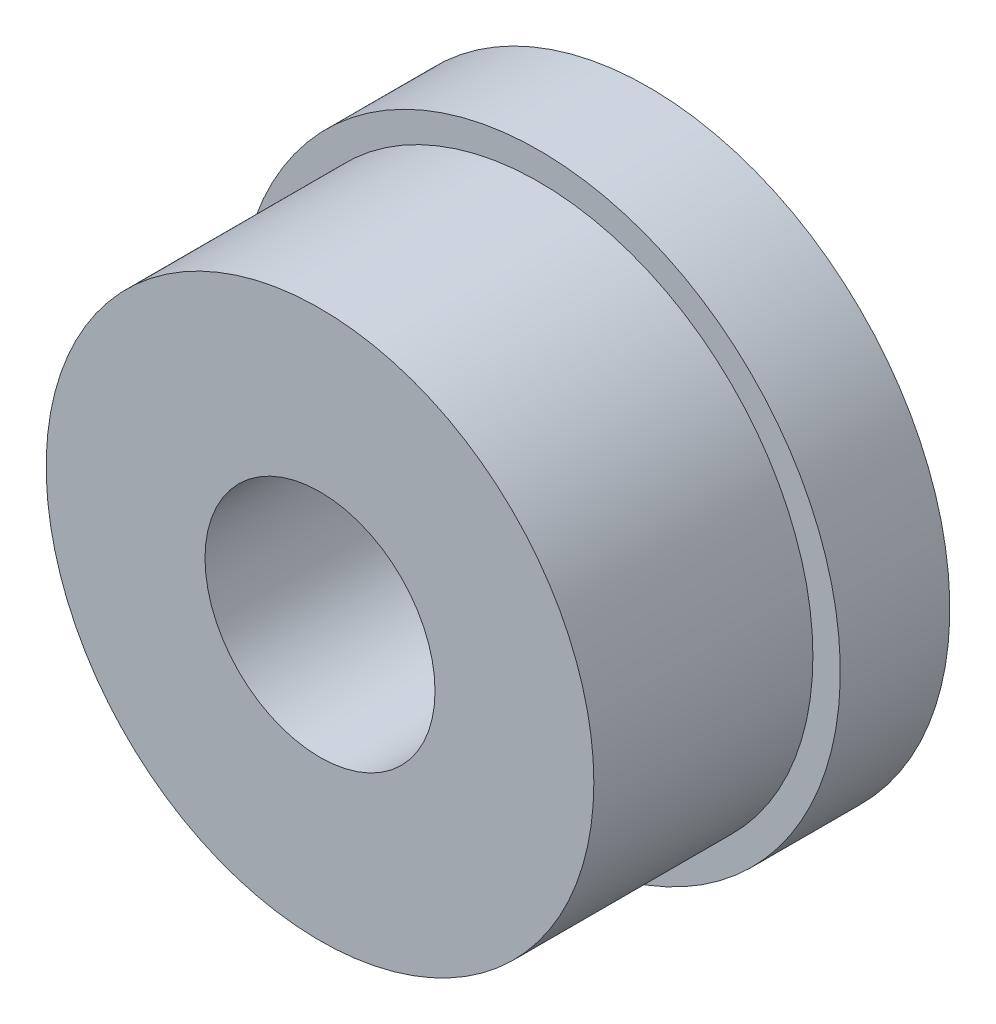
ISO-10303-21;
HEADER;
FILE_DESCRIPTION(('STEP AP214'),'2;1');
FILE_NAME('part.step','',(''),(''),'','','');
FILE_SCHEMA(('AUTOMOTIVE_DESIGN { 1 0 10303 214 1 1 1 1 }'));
ENDSEC;
DATA;
#1=APPLICATION_CONTEXT('core data for automotive mechanical design processes');
#2=APPLICATION_PROTOCOL_DEFINITION('international standard','automotive_design',2000,#1);
#3=PRODUCT_CONTEXT('',#1,'mechanical');
#4=PRODUCT('Part','Part','',(#3));
#5=PRODUCT_RELATED_PRODUCT_CATEGORY('part','',(#4));
#6=PRODUCT_DEFINITION_FORMATION('','',#4);
#7=PRODUCT_DEFINITION_CONTEXT('part definition',#1,'design');
#8=PRODUCT_DEFINITION('design','',#6,#7);
#9=PRODUCT_DEFINITION_SHAPE('','',#8);
#10=(LENGTH_UNIT() NAMED_UNIT(*) SI_UNIT(.MILLI.,.METRE.));
#11=(NAMED_UNIT(*) PLANE_ANGLE_UNIT() SI_UNIT($,.RADIAN.));
#12=(NAMED_UNIT(*) SI_UNIT($,.STERADIAN.) SOLID_ANGLE_UNIT());
#13=UNCERTAINTY_MEASURE_WITH_UNIT(LENGTH_MEASURE(1.E-05),#10,'distance_accuracy_value','');
#14=(GEOMETRIC_REPRESENTATION_CONTEXT(3) GLOBAL_UNCERTAINTY_ASSIGNED_CONTEXT((#13)) GLOBAL_UNIT_ASSIGNED_CONTEXT((#10,
#11,#12)) REPRESENTATION_CONTEXT('',''));
#15=CARTESIAN_POINT('',(0.,0.,0.));
#16=DIRECTION('',(0.,0.,1.));
#17=DIRECTION('',(1.,0.,0.));
#18=AXIS2_PLACEMENT_3D('',#15,#16,#17);
#19=CARTESIAN_POINT('',(0.,0.,-2.));
#20=DIRECTION('',(0.,0.,1.));
#21=DIRECTION('',(1.,0.,0.));
#22=AXIS2_PLACEMENT_3D('',#19,#20,#21);
#23=CYLINDRICAL_SURFACE('',#22,2.1);
#24=CARTESIAN_POINT('',(0.,0.,4.));
#25=DIRECTION('',(0.,0.,1.));
#26=DIRECTION('',(1.,0.,0.));
#27=AXIS2_PLACEMENT_3D('',#24,#25,#26);
#28=CIRCLE('',#27,2.1);
#29=CARTESIAN_POINT('',(2.1,0.,4.));
#30=VERTEX_POINT('',#29);
#31=EDGE_CURVE('E49',#30,#30,#28,.T.);
#32=ORIENTED_EDGE('',*,*,#31,.T.);
#33=EDGE_LOOP('',(#32));
#34=FACE_BOUND('',#33,.T.);
#35=CARTESIAN_POINT('',(0.,0.,1.));
#36=DIRECTION('',(0.,0.,-1.));
#37=DIRECTION('',(-1.,0.,0.));
#38=AXIS2_PLACEMENT_3D('',#35,#36,#37);
#39=CIRCLE('',#38,2.1);
#40=CARTESIAN_POINT('',(-2.1,0.,1.));
#41=VERTEX_POINT('',#40);
#42=EDGE_CURVE('E35',#41,#41,#39,.F.);
#43=ORIENTED_EDGE('',*,*,#42,.F.);
#44=EDGE_LOOP('',(#43));
#45=FACE_BOUND('',#44,.T.);
#46=ADVANCED_FACE('F31',(#34,#45),#23,.F.);
#47=CARTESIAN_POINT('',(0.,0.,4.));
#48=DIRECTION('',(0.,0.,-1.));
#49=DIRECTION('',(-1.,0.,0.));
#50=AXIS2_PLACEMENT_3D('',#47,#48,#49);
#51=CYLINDRICAL_SURFACE('',#50,5.);
#52=CARTESIAN_POINT('',(0.,0.,4.));
#53=DIRECTION('',(0.,0.,1.));
#54=DIRECTION('',(1.,0.,0.));
#55=AXIS2_PLACEMENT_3D('',#52,#53,#54);
#56=CIRCLE('',#55,5.);
#57=CARTESIAN_POINT('',(5.,0.,4.));
#58=VERTEX_POINT('',#57);
#59=EDGE_CURVE('E10',#58,#58,#56,.T.);
#60=ORIENTED_EDGE('',*,*,#59,.F.);
#61=EDGE_LOOP('',(#60));
#62=FACE_BOUND('',#61,.T.);
#63=CARTESIAN_POINT('',(0.,0.,0.));
#64=DIRECTION('',(0.,0.,1.));
#65=DIRECTION('',(1.,0.,0.));
#66=AXIS2_PLACEMENT_3D('',#63,#64,#65);
#67=CIRCLE('',#66,5.);
#68=CARTESIAN_POINT('',(5.,0.,0.));
#69=VERTEX_POINT('',#68);
#70=EDGE_CURVE('E39',#69,#69,#67,.T.);
#71=ORIENTED_EDGE('',*,*,#70,.T.);
#72=EDGE_LOOP('',(#71));
#73=FACE_BOUND('',#72,.T.);
#74=ADVANCED_FACE('F33',(#62,#73),#51,.T.);
#75=CARTESIAN_POINT('',(0.,0.,4.));
#76=DIRECTION('',(0.,0.,1.));
#77=DIRECTION('',(1.,0.,0.));
#78=AXIS2_PLACEMENT_3D('',#75,#76,#77);
#79=PLANE('',#78);
#80=ORIENTED_EDGE('',*,*,#31,.F.);
#81=EDGE_LOOP('',(#80));
#82=FACE_BOUND('',#81,.T.);
#83=ORIENTED_EDGE('',*,*,#59,.T.);
#84=EDGE_LOOP('',(#83));
#85=FACE_BOUND('',#84,.T.);
#86=ADVANCED_FACE('F72',(#82,#85),#79,.T.);
#87=CARTESIAN_POINT('',(0.,0.,-2.));
#88=DIRECTION('',(0.,0.,1.));
#89=DIRECTION('',(1.,0.,0.));
#90=AXIS2_PLACEMENT_3D('',#87,#88,#89);
#91=CYLINDRICAL_SURFACE('',#90,5.5);
#92=CARTESIAN_POINT('',(0.,0.,-2.));
#93=DIRECTION('',(0.,0.,-1.));
#94=DIRECTION('',(-1.,0.,0.));
#95=AXIS2_PLACEMENT_3D('',#92,#93,#94);
#96=CIRCLE('',#95,5.5);
#97=CARTESIAN_POINT('',(-5.5,0.,-2.));
#98=VERTEX_POINT('',#97);
#99=EDGE_CURVE('E44',#98,#98,#96,.T.);
#100=ORIENTED_EDGE('',*,*,#99,.F.);
#101=EDGE_LOOP('',(#100));
#102=FACE_BOUND('',#101,.T.);
#103=CARTESIAN_POINT('',(0.,0.,0.));
#104=DIRECTION('',(0.,0.,-1.));
#105=DIRECTION('',(-1.,0.,0.));
#106=AXIS2_PLACEMENT_3D('',#103,#104,#105);
#107=CIRCLE('',#106,5.5);
#108=CARTESIAN_POINT('',(-5.5,0.,0.));
#109=VERTEX_POINT('',#108);
#110=EDGE_CURVE('E46',#109,#109,#107,.T.);
#111=ORIENTED_EDGE('',*,*,#110,.T.);
#112=EDGE_LOOP('',(#111));
#113=FACE_BOUND('',#112,.T.);
#114=ADVANCED_FACE('F82',(#102,#113),#91,.T.);
#115=CARTESIAN_POINT('',(0.,0.,-2.));
#116=DIRECTION('',(0.,0.,-1.));
#117=DIRECTION('',(-1.,0.,0.));
#118=AXIS2_PLACEMENT_3D('',#115,#116,#117);
#119=PLANE('',#118);
#120=CARTESIAN_POINT('',(0.,0.,-2.));
#121=DIRECTION('',(0.,0.,-1.));
#122=DIRECTION('',(-1.,0.,0.));
#123=AXIS2_PLACEMENT_3D('',#120,#121,#122);
#124=CIRCLE('',#123,4.);
#125=CARTESIAN_POINT('',(-4.,0.,-2.));
#126=VERTEX_POINT('',#125);
#127=EDGE_CURVE('E54',#126,#126,#124,.T.);
#128=ORIENTED_EDGE('',*,*,#127,.F.);
#129=EDGE_LOOP('',(#128));
#130=FACE_BOUND('',#129,.T.);
#131=ORIENTED_EDGE('',*,*,#99,.T.);
#132=EDGE_LOOP('',(#131));
#133=FACE_BOUND('',#132,.T.);
#134=ADVANCED_FACE('F78',(#130,#133),#119,.T.);
#135=CARTESIAN_POINT('',(0.,0.,0.));
#136=DIRECTION('',(0.,0.,-1.));
#137=DIRECTION('',(-1.,0.,0.));
#138=AXIS2_PLACEMENT_3D('',#135,#136,#137);
#139=PLANE('',#138);
#140=ORIENTED_EDGE('',*,*,#70,.F.);
#141=EDGE_LOOP('',(#140));
#142=FACE_BOUND('',#141,.T.);
#143=ORIENTED_EDGE('',*,*,#110,.F.);
#144=EDGE_LOOP('',(#143));
#145=FACE_BOUND('',#144,.T.);
#146=ADVANCED_FACE('F81',(#142,#145),#139,.F.);
#147=CARTESIAN_POINT('',(0.,0.,1.));
#148=DIRECTION('',(0.,0.,-1.));
#149=DIRECTION('',(-1.,0.,0.));
#150=AXIS2_PLACEMENT_3D('',#147,#148,#149);
#151=PLANE('',#150);
#152=CARTESIAN_POINT('',(0.,0.,1.));
#153=DIRECTION('',(0.,0.,-1.));
#154=DIRECTION('',(-1.,0.,0.));
#155=AXIS2_PLACEMENT_3D('',#152,#153,#154);
#156=CIRCLE('',#155,4.);
#157=CARTESIAN_POINT('',(-4.,0.,1.));
#158=VERTEX_POINT('',#157);
#159=EDGE_CURVE('E57',#158,#158,#156,.T.);
#160=ORIENTED_EDGE('',*,*,#159,.T.);
#161=EDGE_LOOP('',(#160));
#162=FACE_BOUND('',#161,.T.);
#163=ORIENTED_EDGE('',*,*,#42,.T.);
#164=EDGE_LOOP('',(#163));
#165=FACE_BOUND('',#164,.T.);
#166=ADVANCED_FACE('F64',(#162,#165),#151,.T.);
#167=CARTESIAN_POINT('',(0.,0.,1.));
#168=DIRECTION('',(0.,0.,-1.));
#169=DIRECTION('',(-1.,0.,0.));
#170=AXIS2_PLACEMENT_3D('',#167,#168,#169);
#171=CYLINDRICAL_SURFACE('',#170,4.);
#172=ORIENTED_EDGE('',*,*,#159,.F.);
#173=EDGE_LOOP('',(#172));
#174=FACE_BOUND('',#173,.T.);
#175=ORIENTED_EDGE('',*,*,#127,.T.);
#176=EDGE_LOOP('',(#175));
#177=FACE_BOUND('',#176,.T.);
#178=ADVANCED_FACE('F76',(#174,#177),#171,.F.);
#179=CLOSED_SHELL('',(#46,#74,#86,#114,#134,#146,#166,#178));
#180=MANIFOLD_SOLID_BREP('B2',#179);
#181=ADVANCED_BREP_SHAPE_REPRESENTATION('',(#18,#180),#14);
#182=SHAPE_DEFINITION_REPRESENTATION(#9,#181);
ENDSEC;
END-ISO-10303-21;
